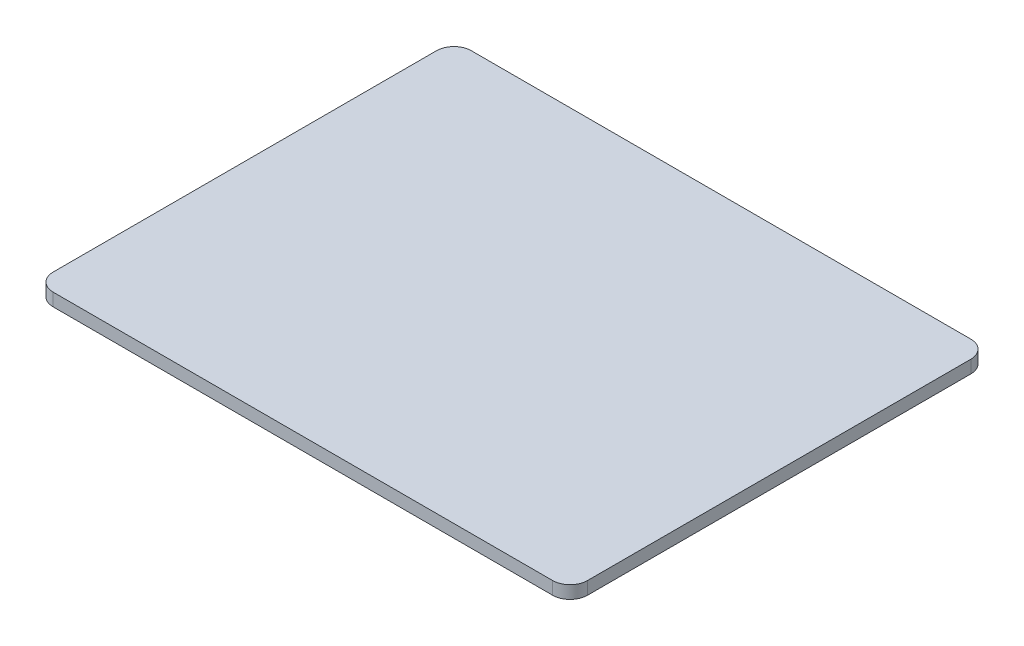
ISO-10303-21;
HEADER;
FILE_DESCRIPTION(('STEP AP214'),'2;1');
FILE_NAME('part.step','',(''),(''),'','','');
FILE_SCHEMA(('AUTOMOTIVE_DESIGN { 1 0 10303 214 1 1 1 1 }'));
ENDSEC;
DATA;
#1=APPLICATION_CONTEXT('core data for automotive mechanical design processes');
#2=APPLICATION_PROTOCOL_DEFINITION('international standard','automotive_design',2000,#1);
#3=PRODUCT_CONTEXT('',#1,'mechanical');
#4=PRODUCT('Part','Part','',(#3));
#5=PRODUCT_RELATED_PRODUCT_CATEGORY('part','',(#4));
#6=PRODUCT_DEFINITION_FORMATION('','',#4);
#7=PRODUCT_DEFINITION_CONTEXT('part definition',#1,'design');
#8=PRODUCT_DEFINITION('design','',#6,#7);
#9=PRODUCT_DEFINITION_SHAPE('','',#8);
#10=(LENGTH_UNIT() NAMED_UNIT(*) SI_UNIT(.MILLI.,.METRE.));
#11=(NAMED_UNIT(*) PLANE_ANGLE_UNIT() SI_UNIT($,.RADIAN.));
#12=(NAMED_UNIT(*) SI_UNIT($,.STERADIAN.) SOLID_ANGLE_UNIT());
#13=UNCERTAINTY_MEASURE_WITH_UNIT(LENGTH_MEASURE(1.E-05),#10,'distance_accuracy_value','');
#14=(GEOMETRIC_REPRESENTATION_CONTEXT(3) GLOBAL_UNCERTAINTY_ASSIGNED_CONTEXT((#13)) GLOBAL_UNIT_ASSIGNED_CONTEXT((#10,
#11,#12)) REPRESENTATION_CONTEXT('',''));
#15=CARTESIAN_POINT('',(0.,0.,0.));
#16=DIRECTION('',(0.,0.,1.));
#17=DIRECTION('',(1.,0.,0.));
#18=AXIS2_PLACEMENT_3D('',#15,#16,#17);
#19=CARTESIAN_POINT('',(-21.5,1.1,16.5));
#20=DIRECTION('',(0.,-1.,0.));
#21=DIRECTION('',(0.,0.,-1.));
#22=AXIS2_PLACEMENT_3D('',#19,#20,#21);
#23=CYLINDRICAL_SURFACE('',#22,1.5);
#24=CARTESIAN_POINT('',(-21.5,0.,16.5));
#25=DIRECTION('',(0.,1.,0.));
#26=DIRECTION('',(0.,0.,-1.));
#27=AXIS2_PLACEMENT_3D('',#24,#25,#26);
#28=CIRCLE('',#27,1.5);
#29=CARTESIAN_POINT('',(-23.,0.,16.5));
#30=VERTEX_POINT('',#29);
#31=CARTESIAN_POINT('',(-21.5,0.,18.));
#32=VERTEX_POINT('',#31);
#33=EDGE_CURVE('E129',#30,#32,#28,.T.);
#34=ORIENTED_EDGE('',*,*,#33,.T.);
#35=DIRECTION('',(0.,-1.,0.));
#36=VECTOR('',#35,1.);
#37=CARTESIAN_POINT('',(-21.5,1.1,18.));
#38=LINE('',#37,#36);
#39=CARTESIAN_POINT('',(-21.5,1.1,18.));
#40=VERTEX_POINT('',#39);
#41=EDGE_CURVE('E11',#40,#32,#38,.T.);
#42=ORIENTED_EDGE('',*,*,#41,.F.);
#43=CARTESIAN_POINT('',(-21.5,1.1,16.5));
#44=DIRECTION('',(0.,1.,0.));
#45=DIRECTION('',(0.,0.,-1.));
#46=AXIS2_PLACEMENT_3D('',#43,#44,#45);
#47=CIRCLE('',#46,1.5);
#48=CARTESIAN_POINT('',(-23.,1.1,16.5));
#49=VERTEX_POINT('',#48);
#50=EDGE_CURVE('E143',#49,#40,#47,.T.);
#51=ORIENTED_EDGE('',*,*,#50,.F.);
#52=DIRECTION('',(0.,-1.,0.));
#53=VECTOR('',#52,1.);
#54=CARTESIAN_POINT('',(-23.,1.1,16.5));
#55=LINE('',#54,#53);
#56=EDGE_CURVE('E125',#49,#30,#55,.T.);
#57=ORIENTED_EDGE('',*,*,#56,.T.);
#58=EDGE_LOOP('',(#34,#42,#51,#57));
#59=FACE_BOUND('',#58,.T.);
#60=ADVANCED_FACE('F33',(#59),#23,.T.);
#61=CARTESIAN_POINT('',(-21.5,1.1,18.));
#62=DIRECTION('',(0.,0.,-1.));
#63=DIRECTION('',(-1.,0.,0.));
#64=AXIS2_PLACEMENT_3D('',#61,#62,#63);
#65=PLANE('',#64);
#66=DIRECTION('',(1.,0.,0.));
#67=VECTOR('',#66,1.);
#68=CARTESIAN_POINT('',(-21.5,0.,18.));
#69=LINE('',#68,#67);
#70=CARTESIAN_POINT('',(21.5,0.,18.));
#71=VERTEX_POINT('',#70);
#72=EDGE_CURVE('E132',#32,#71,#69,.T.);
#73=ORIENTED_EDGE('',*,*,#72,.T.);
#74=DIRECTION('',(0.,-1.,0.));
#75=VECTOR('',#74,1.);
#76=CARTESIAN_POINT('',(21.5,1.1,18.));
#77=LINE('',#76,#75);
#78=CARTESIAN_POINT('',(21.5,1.1,18.));
#79=VERTEX_POINT('',#78);
#80=EDGE_CURVE('E41',#79,#71,#77,.T.);
#81=ORIENTED_EDGE('',*,*,#80,.F.);
#82=DIRECTION('',(1.,0.,0.));
#83=VECTOR('',#82,1.);
#84=CARTESIAN_POINT('',(-21.5,1.1,18.));
#85=LINE('',#84,#83);
#86=EDGE_CURVE('E92',#40,#79,#85,.T.);
#87=ORIENTED_EDGE('',*,*,#86,.F.);
#88=ORIENTED_EDGE('',*,*,#41,.T.);
#89=EDGE_LOOP('',(#73,#81,#87,#88));
#90=FACE_BOUND('',#89,.T.);
#91=ADVANCED_FACE('F178',(#90),#65,.F.);
#92=CARTESIAN_POINT('',(21.5,1.1,16.5));
#93=DIRECTION('',(0.,-1.,0.));
#94=DIRECTION('',(0.,0.,-1.));
#95=AXIS2_PLACEMENT_3D('',#92,#93,#94);
#96=CYLINDRICAL_SURFACE('',#95,1.5);
#97=CARTESIAN_POINT('',(21.5,0.,16.5));
#98=DIRECTION('',(0.,1.,0.));
#99=DIRECTION('',(0.,0.,1.));
#100=AXIS2_PLACEMENT_3D('',#97,#98,#99);
#101=CIRCLE('',#100,1.5);
#102=CARTESIAN_POINT('',(23.,0.,16.5));
#103=VERTEX_POINT('',#102);
#104=EDGE_CURVE('E134',#71,#103,#101,.T.);
#105=ORIENTED_EDGE('',*,*,#104,.T.);
#106=DIRECTION('',(0.,-1.,0.));
#107=VECTOR('',#106,1.);
#108=CARTESIAN_POINT('',(23.,1.1,16.5));
#109=LINE('',#108,#107);
#110=CARTESIAN_POINT('',(23.,1.1,16.5));
#111=VERTEX_POINT('',#110);
#112=EDGE_CURVE('E150',#111,#103,#109,.T.);
#113=ORIENTED_EDGE('',*,*,#112,.F.);
#114=CARTESIAN_POINT('',(21.5,1.1,16.5));
#115=DIRECTION('',(0.,1.,0.));
#116=DIRECTION('',(0.,0.,1.));
#117=AXIS2_PLACEMENT_3D('',#114,#115,#116);
#118=CIRCLE('',#117,1.5);
#119=EDGE_CURVE('E158',#79,#111,#118,.T.);
#120=ORIENTED_EDGE('',*,*,#119,.F.);
#121=ORIENTED_EDGE('',*,*,#80,.T.);
#122=EDGE_LOOP('',(#105,#113,#120,#121));
#123=FACE_BOUND('',#122,.T.);
#124=ADVANCED_FACE('F156',(#123),#96,.T.);
#125=CARTESIAN_POINT('',(23.,1.1,-16.5));
#126=DIRECTION('',(-1.,0.,0.));
#127=DIRECTION('',(0.,0.,1.));
#128=AXIS2_PLACEMENT_3D('',#125,#126,#127);
#129=PLANE('',#128);
#130=DIRECTION('',(0.,0.,-1.));
#131=VECTOR('',#130,1.);
#132=CARTESIAN_POINT('',(23.,0.,-16.5));
#133=LINE('',#132,#131);
#134=CARTESIAN_POINT('',(23.,0.,-16.5));
#135=VERTEX_POINT('',#134);
#136=EDGE_CURVE('E136',#103,#135,#133,.T.);
#137=ORIENTED_EDGE('',*,*,#136,.T.);
#138=DIRECTION('',(0.,-1.,0.));
#139=VECTOR('',#138,1.);
#140=CARTESIAN_POINT('',(23.,1.1,-16.5));
#141=LINE('',#140,#139);
#142=CARTESIAN_POINT('',(23.,1.1,-16.5));
#143=VERTEX_POINT('',#142);
#144=EDGE_CURVE('E147',#143,#135,#141,.T.);
#145=ORIENTED_EDGE('',*,*,#144,.F.);
#146=DIRECTION('',(0.,0.,-1.));
#147=VECTOR('',#146,1.);
#148=CARTESIAN_POINT('',(23.,1.1,-16.5));
#149=LINE('',#148,#147);
#150=EDGE_CURVE('E170',#111,#143,#149,.T.);
#151=ORIENTED_EDGE('',*,*,#150,.F.);
#152=ORIENTED_EDGE('',*,*,#112,.T.);
#153=EDGE_LOOP('',(#137,#145,#151,#152));
#154=FACE_BOUND('',#153,.T.);
#155=ADVANCED_FACE('F166',(#154),#129,.F.);
#156=CARTESIAN_POINT('',(21.5,1.1,-16.5));
#157=DIRECTION('',(0.,-1.,0.));
#158=DIRECTION('',(0.,0.,-1.));
#159=AXIS2_PLACEMENT_3D('',#156,#157,#158);
#160=CYLINDRICAL_SURFACE('',#159,1.5);
#161=CARTESIAN_POINT('',(21.5,0.,-16.5));
#162=DIRECTION('',(0.,1.,0.));
#163=DIRECTION('',(0.,0.,1.));
#164=AXIS2_PLACEMENT_3D('',#161,#162,#163);
#165=CIRCLE('',#164,1.5);
#166=CARTESIAN_POINT('',(21.5,0.,-18.));
#167=VERTEX_POINT('',#166);
#168=EDGE_CURVE('E138',#135,#167,#165,.T.);
#169=ORIENTED_EDGE('',*,*,#168,.T.);
#170=DIRECTION('',(0.,-1.,0.));
#171=VECTOR('',#170,1.);
#172=CARTESIAN_POINT('',(21.5,1.1,-18.));
#173=LINE('',#172,#171);
#174=CARTESIAN_POINT('',(21.5,1.1,-18.));
#175=VERTEX_POINT('',#174);
#176=EDGE_CURVE('E120',#175,#167,#173,.T.);
#177=ORIENTED_EDGE('',*,*,#176,.F.);
#178=CARTESIAN_POINT('',(21.5,1.1,-16.5));
#179=DIRECTION('',(0.,1.,0.));
#180=DIRECTION('',(0.,0.,1.));
#181=AXIS2_PLACEMENT_3D('',#178,#179,#180);
#182=CIRCLE('',#181,1.5);
#183=EDGE_CURVE('E111',#143,#175,#182,.T.);
#184=ORIENTED_EDGE('',*,*,#183,.F.);
#185=ORIENTED_EDGE('',*,*,#144,.T.);
#186=EDGE_LOOP('',(#169,#177,#184,#185));
#187=FACE_BOUND('',#186,.T.);
#188=ADVANCED_FACE('F169',(#187),#160,.T.);
#189=CARTESIAN_POINT('',(-21.5,1.1,-18.));
#190=DIRECTION('',(0.,0.,1.));
#191=DIRECTION('',(1.,0.,0.));
#192=AXIS2_PLACEMENT_3D('',#189,#190,#191);
#193=PLANE('',#192);
#194=DIRECTION('',(-1.,0.,0.));
#195=VECTOR('',#194,1.);
#196=CARTESIAN_POINT('',(-21.5,0.,-18.));
#197=LINE('',#196,#195);
#198=CARTESIAN_POINT('',(-21.5,0.,-18.));
#199=VERTEX_POINT('',#198);
#200=EDGE_CURVE('E119',#167,#199,#197,.T.);
#201=ORIENTED_EDGE('',*,*,#200,.T.);
#202=DIRECTION('',(0.,-1.,0.));
#203=VECTOR('',#202,1.);
#204=CARTESIAN_POINT('',(-21.5,1.1,-18.));
#205=LINE('',#204,#203);
#206=CARTESIAN_POINT('',(-21.5,1.1,-18.));
#207=VERTEX_POINT('',#206);
#208=EDGE_CURVE('E116',#207,#199,#205,.T.);
#209=ORIENTED_EDGE('',*,*,#208,.F.);
#210=DIRECTION('',(-1.,0.,0.));
#211=VECTOR('',#210,1.);
#212=CARTESIAN_POINT('',(-21.5,1.1,-18.));
#213=LINE('',#212,#211);
#214=EDGE_CURVE('E105',#175,#207,#213,.T.);
#215=ORIENTED_EDGE('',*,*,#214,.F.);
#216=ORIENTED_EDGE('',*,*,#176,.T.);
#217=EDGE_LOOP('',(#201,#209,#215,#216));
#218=FACE_BOUND('',#217,.T.);
#219=ADVANCED_FACE('F117',(#218),#193,.F.);
#220=CARTESIAN_POINT('',(-21.5,1.1,-16.5));
#221=DIRECTION('',(0.,-1.,0.));
#222=DIRECTION('',(0.,0.,-1.));
#223=AXIS2_PLACEMENT_3D('',#220,#221,#222);
#224=CYLINDRICAL_SURFACE('',#223,1.5);
#225=CARTESIAN_POINT('',(-21.5,0.,-16.5));
#226=DIRECTION('',(0.,1.,0.));
#227=DIRECTION('',(0.,0.,-1.));
#228=AXIS2_PLACEMENT_3D('',#225,#226,#227);
#229=CIRCLE('',#228,1.5);
#230=CARTESIAN_POINT('',(-23.,0.,-16.5));
#231=VERTEX_POINT('',#230);
#232=EDGE_CURVE('E78',#199,#231,#229,.T.);
#233=ORIENTED_EDGE('',*,*,#232,.T.);
#234=DIRECTION('',(0.,-1.,0.));
#235=VECTOR('',#234,1.);
#236=CARTESIAN_POINT('',(-23.,1.1,-16.5));
#237=LINE('',#236,#235);
#238=CARTESIAN_POINT('',(-23.,1.1,-16.5));
#239=VERTEX_POINT('',#238);
#240=EDGE_CURVE('E121',#239,#231,#237,.T.);
#241=ORIENTED_EDGE('',*,*,#240,.F.);
#242=CARTESIAN_POINT('',(-21.5,1.1,-16.5));
#243=DIRECTION('',(0.,1.,0.));
#244=DIRECTION('',(0.,0.,-1.));
#245=AXIS2_PLACEMENT_3D('',#242,#243,#244);
#246=CIRCLE('',#245,1.5);
#247=EDGE_CURVE('E109',#207,#239,#246,.T.);
#248=ORIENTED_EDGE('',*,*,#247,.F.);
#249=ORIENTED_EDGE('',*,*,#208,.T.);
#250=EDGE_LOOP('',(#233,#241,#248,#249));
#251=FACE_BOUND('',#250,.T.);
#252=ADVANCED_FACE('F123',(#251),#224,.T.);
#253=CARTESIAN_POINT('',(-23.,1.1,-16.5));
#254=DIRECTION('',(1.,0.,0.));
#255=DIRECTION('',(0.,0.,-1.));
#256=AXIS2_PLACEMENT_3D('',#253,#254,#255);
#257=PLANE('',#256);
#258=DIRECTION('',(0.,0.,1.));
#259=VECTOR('',#258,1.);
#260=CARTESIAN_POINT('',(-23.,0.,-16.5));
#261=LINE('',#260,#259);
#262=EDGE_CURVE('E84',#231,#30,#261,.T.);
#263=ORIENTED_EDGE('',*,*,#262,.T.);
#264=ORIENTED_EDGE('',*,*,#56,.F.);
#265=DIRECTION('',(0.,0.,1.));
#266=VECTOR('',#265,1.);
#267=CARTESIAN_POINT('',(-23.,1.1,-16.5));
#268=LINE('',#267,#266);
#269=EDGE_CURVE('E49',#239,#49,#268,.T.);
#270=ORIENTED_EDGE('',*,*,#269,.F.);
#271=ORIENTED_EDGE('',*,*,#240,.T.);
#272=EDGE_LOOP('',(#263,#264,#270,#271));
#273=FACE_BOUND('',#272,.T.);
#274=ADVANCED_FACE('F194',(#273),#257,.F.);
#275=CARTESIAN_POINT('',(-21.5,1.1,16.5));
#276=DIRECTION('',(0.,-1.,0.));
#277=DIRECTION('',(0.,0.,-1.));
#278=AXIS2_PLACEMENT_3D('',#275,#276,#277);
#279=PLANE('',#278);
#280=ORIENTED_EDGE('',*,*,#50,.T.);
#281=ORIENTED_EDGE('',*,*,#86,.T.);
#282=ORIENTED_EDGE('',*,*,#119,.T.);
#283=ORIENTED_EDGE('',*,*,#150,.T.);
#284=ORIENTED_EDGE('',*,*,#183,.T.);
#285=ORIENTED_EDGE('',*,*,#214,.T.);
#286=ORIENTED_EDGE('',*,*,#247,.T.);
#287=ORIENTED_EDGE('',*,*,#269,.T.);
#288=EDGE_LOOP('',(#280,#281,#282,#283,#284,#285,#286,#287));
#289=FACE_BOUND('',#288,.T.);
#290=ADVANCED_FACE('F107',(#289),#279,.F.);
#291=CARTESIAN_POINT('',(-21.5,0.,16.5));
#292=DIRECTION('',(0.,-1.,0.));
#293=DIRECTION('',(0.,0.,-1.));
#294=AXIS2_PLACEMENT_3D('',#291,#292,#293);
#295=PLANE('',#294);
#296=ORIENTED_EDGE('',*,*,#33,.F.);
#297=ORIENTED_EDGE('',*,*,#262,.F.);
#298=ORIENTED_EDGE('',*,*,#232,.F.);
#299=ORIENTED_EDGE('',*,*,#200,.F.);
#300=ORIENTED_EDGE('',*,*,#168,.F.);
#301=ORIENTED_EDGE('',*,*,#136,.F.);
#302=ORIENTED_EDGE('',*,*,#104,.F.);
#303=ORIENTED_EDGE('',*,*,#72,.F.);
#304=EDGE_LOOP('',(#296,#297,#298,#299,#300,#301,#302,#303));
#305=FACE_BOUND('',#304,.T.);
#306=ADVANCED_FACE('F162',(#305),#295,.T.);
#307=CLOSED_SHELL('',(#60,#91,#124,#155,#188,#219,#252,#274,#290,#306));
#308=MANIFOLD_SOLID_BREP('B2',#307);
#309=ADVANCED_BREP_SHAPE_REPRESENTATION('',(#18,#308),#14);
#310=SHAPE_DEFINITION_REPRESENTATION(#9,#309);
ENDSEC;
END-ISO-10303-21;
